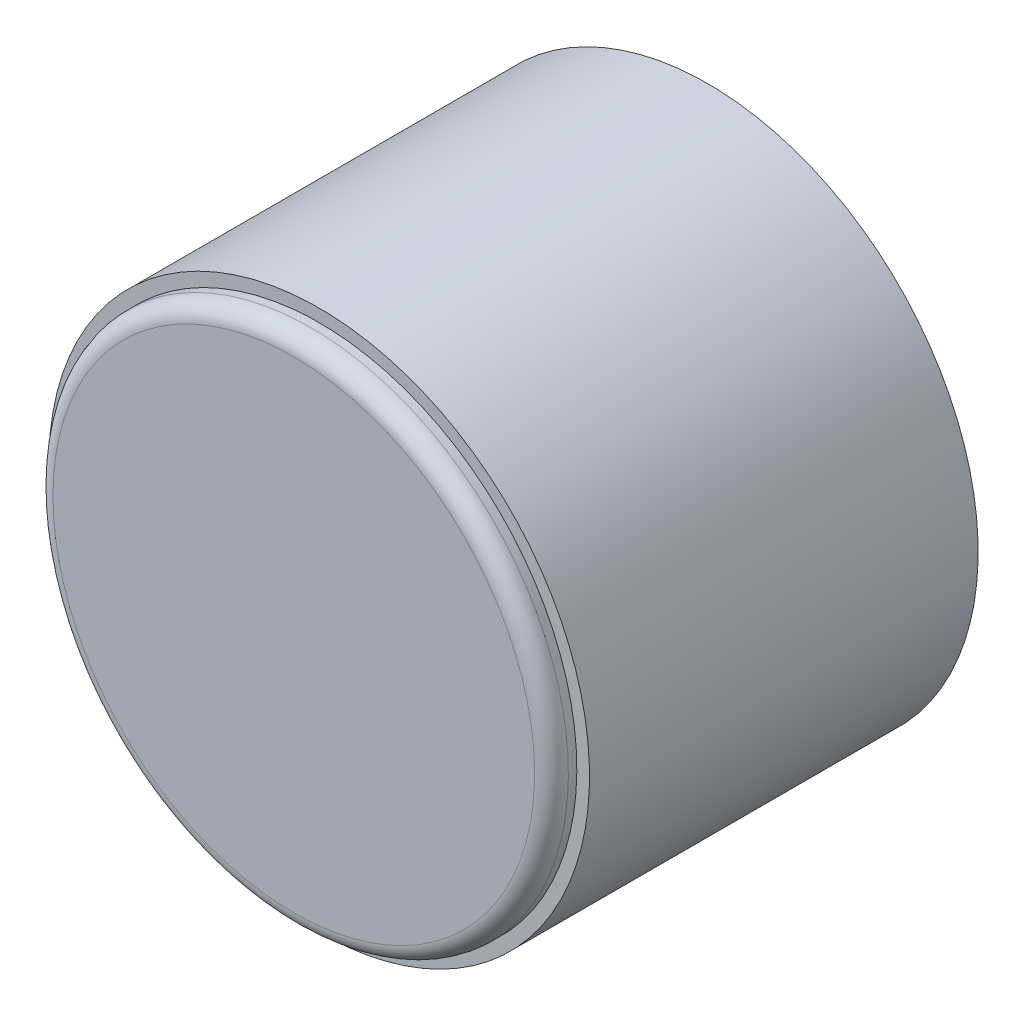
ISO-10303-21;
HEADER;
FILE_DESCRIPTION(('STEP AP214'),'2;1');
FILE_NAME('part.step','',(''),(''),'','','');
FILE_SCHEMA(('AUTOMOTIVE_DESIGN { 1 0 10303 214 1 1 1 1 }'));
ENDSEC;
DATA;
#1=APPLICATION_CONTEXT('core data for automotive mechanical design processes');
#2=APPLICATION_PROTOCOL_DEFINITION('international standard','automotive_design',2000,#1);
#3=PRODUCT_CONTEXT('',#1,'mechanical');
#4=PRODUCT('Part','Part','',(#3));
#5=PRODUCT_RELATED_PRODUCT_CATEGORY('part','',(#4));
#6=PRODUCT_DEFINITION_FORMATION('','',#4);
#7=PRODUCT_DEFINITION_CONTEXT('part definition',#1,'design');
#8=PRODUCT_DEFINITION('design','',#6,#7);
#9=PRODUCT_DEFINITION_SHAPE('','',#8);
#10=(LENGTH_UNIT() NAMED_UNIT(*) SI_UNIT(.MILLI.,.METRE.));
#11=(NAMED_UNIT(*) PLANE_ANGLE_UNIT() SI_UNIT($,.RADIAN.));
#12=(NAMED_UNIT(*) SI_UNIT($,.STERADIAN.) SOLID_ANGLE_UNIT());
#13=UNCERTAINTY_MEASURE_WITH_UNIT(LENGTH_MEASURE(1.E-05),#10,'distance_accuracy_value','');
#14=(GEOMETRIC_REPRESENTATION_CONTEXT(3) GLOBAL_UNCERTAINTY_ASSIGNED_CONTEXT((#13)) GLOBAL_UNIT_ASSIGNED_CONTEXT((#10,
#11,#12)) REPRESENTATION_CONTEXT('',''));
#15=CARTESIAN_POINT('',(0.,0.,0.));
#16=DIRECTION('',(0.,0.,1.));
#17=DIRECTION('',(1.,0.,0.));
#18=AXIS2_PLACEMENT_3D('',#15,#16,#17);
#19=CARTESIAN_POINT('',(-0.0195470693560484,0.0021960919807713,195.292271057495));
#20=DIRECTION('',(0.,0.,1.));
#21=DIRECTION('',(0.,-1.,0.));
#22=AXIS2_PLACEMENT_3D('',#19,#20,#21);
#23=CYLINDRICAL_SURFACE('',#22,16.);
#24=CARTESIAN_POINT('',(-0.0195470693560484,0.0021960919807713,195.292271057495));
#25=DIRECTION('',(0.,0.,1.));
#26=DIRECTION('',(-0.383049008063237,0.923728021347068,0.));
#27=AXIS2_PLACEMENT_3D('',#24,#25,#26);
#28=CIRCLE('',#27,16.);
#29=CARTESIAN_POINT('',(-6.14833119836785,14.7818444335339,195.292271057495));
#30=VERTEX_POINT('',#29);
#31=EDGE_CURVE('E11',#30,#30,#28,.T.);
#32=ORIENTED_EDGE('',*,*,#31,.T.);
#33=EDGE_LOOP('',(#32));
#34=FACE_BOUND('',#33,.T.);
#35=CARTESIAN_POINT('',(-0.0195470693560484,0.0021960919807713,218.292271057495));
#36=DIRECTION('',(0.,0.,1.));
#37=DIRECTION('',(-0.383049008063237,0.923728021347068,0.));
#38=AXIS2_PLACEMENT_3D('',#35,#36,#37);
#39=CIRCLE('',#38,16.);
#40=CARTESIAN_POINT('',(-6.14833119836785,14.7818444335339,218.292271057495));
#41=VERTEX_POINT('',#40);
#42=EDGE_CURVE('E27',#41,#41,#39,.T.);
#43=ORIENTED_EDGE('',*,*,#42,.F.);
#44=EDGE_LOOP('',(#43));
#45=FACE_BOUND('',#44,.T.);
#46=ADVANCED_FACE('F17',(#34,#45),#23,.T.);
#47=CARTESIAN_POINT('',(-0.0195470693560484,0.0021960919807713,195.292271057495));
#48=DIRECTION('',(0.,0.,1.));
#49=DIRECTION('',(0.383049008063238,-0.923728021347068,0.));
#50=AXIS2_PLACEMENT_3D('',#47,#48,#49);
#51=PLANE('',#50);
#52=ORIENTED_EDGE('',*,*,#31,.F.);
#53=EDGE_LOOP('',(#52));
#54=FACE_BOUND('',#53,.T.);
#55=ADVANCED_FACE('F57',(#54),#51,.F.);
#56=CARTESIAN_POINT('',(-0.0195470693560484,0.0021960919807713,218.292271057495));
#57=DIRECTION('',(0.,0.,1.));
#58=DIRECTION('',(0.383049008063238,-0.923728021347068,0.));
#59=AXIS2_PLACEMENT_3D('',#56,#57,#58);
#60=PLANE('',#59);
#61=CARTESIAN_POINT('',(-0.0195470693560484,0.0021960919807713,218.292271057495));
#62=DIRECTION('',(0.,0.,1.));
#63=DIRECTION('',(-0.383049008063237,0.923728021347068,0.));
#64=AXIS2_PLACEMENT_3D('',#61,#62,#63);
#65=CIRCLE('',#64,15.25);
#66=CARTESIAN_POINT('',(-5.86104444232042,14.0890484175236,218.292271057495));
#67=VERTEX_POINT('',#66);
#68=EDGE_CURVE('E47',#67,#67,#65,.T.);
#69=ORIENTED_EDGE('',*,*,#68,.F.);
#70=EDGE_LOOP('',(#69));
#71=FACE_BOUND('',#70,.T.);
#72=ORIENTED_EDGE('',*,*,#42,.T.);
#73=EDGE_LOOP('',(#72));
#74=FACE_BOUND('',#73,.T.);
#75=ADVANCED_FACE('F54',(#71,#74),#60,.T.);
#76=CARTESIAN_POINT('',(-0.0195470693560484,0.0021960919807713,219.792271057495));
#77=DIRECTION('',(0.,0.,-1.));
#78=DIRECTION('',(0.,1.,0.));
#79=AXIS2_PLACEMENT_3D('',#76,#77,#78);
#80=CYLINDRICAL_SURFACE('',#79,15.25);
#81=CARTESIAN_POINT('',(-0.0195470693560484,0.0021960919807713,218.792271057495));
#82=DIRECTION('',(0.,0.,-1.));
#83=DIRECTION('',(0.383049008063238,-0.923728021347068,0.));
#84=AXIS2_PLACEMENT_3D('',#81,#82,#83);
#85=CIRCLE('',#84,15.25);
#86=CARTESIAN_POINT('',(5.82195030360832,-14.084656233562,218.792271057495));
#87=VERTEX_POINT('',#86);
#88=EDGE_CURVE('E42',#87,#87,#85,.T.);
#89=ORIENTED_EDGE('',*,*,#88,.T.);
#90=EDGE_LOOP('',(#89));
#91=FACE_BOUND('',#90,.T.);
#92=ORIENTED_EDGE('',*,*,#68,.T.);
#93=EDGE_LOOP('',(#92));
#94=FACE_BOUND('',#93,.T.);
#95=ADVANCED_FACE('F68',(#91,#94),#80,.T.);
#96=CARTESIAN_POINT('',(-0.0195470693560484,0.0021960919807713,219.792271057495));
#97=DIRECTION('',(0.,0.,1.));
#98=DIRECTION('',(0.383049008063238,-0.923728021347068,0.));
#99=AXIS2_PLACEMENT_3D('',#96,#97,#98);
#100=PLANE('',#99);
#101=CARTESIAN_POINT('',(-0.0195470693560484,0.0021960919807713,219.792271057495));
#102=DIRECTION('',(0.,0.,1.));
#103=DIRECTION('',(0.383049008063238,-0.923728021347068,0.));
#104=AXIS2_PLACEMENT_3D('',#101,#102,#103);
#105=CIRCLE('',#104,14.25);
#106=CARTESIAN_POINT('',(5.43890129554509,-13.1609282122149,219.792271057495));
#107=VERTEX_POINT('',#106);
#108=EDGE_CURVE('E21',#107,#107,#105,.T.);
#109=ORIENTED_EDGE('',*,*,#108,.T.);
#110=EDGE_LOOP('',(#109));
#111=FACE_BOUND('',#110,.T.);
#112=ADVANCED_FACE('F71',(#111),#100,.T.);
#113=CARTESIAN_POINT('',(-0.0195470693560484,0.0021960919807713,218.792271057495));
#114=DIRECTION('',(0.,0.,1.));
#115=DIRECTION('',(0.383049008063238,-0.923728021347068,0.));
#116=AXIS2_PLACEMENT_3D('',#113,#114,#115);
#117=TOROIDAL_SURFACE('',#116,14.25,1.);
#118=ORIENTED_EDGE('',*,*,#88,.F.);
#119=EDGE_LOOP('',(#118));
#120=FACE_BOUND('',#119,.T.);
#121=ORIENTED_EDGE('',*,*,#108,.F.);
#122=EDGE_LOOP('',(#121));
#123=FACE_BOUND('',#122,.T.);
#124=ADVANCED_FACE('F19',(#120,#123),#117,.T.);
#125=CLOSED_SHELL('',(#46,#55,#75,#95,#112,#124));
#126=MANIFOLD_SOLID_BREP('B1',#125);
#127=ADVANCED_BREP_SHAPE_REPRESENTATION('',(#18,#126),#14);
#128=SHAPE_DEFINITION_REPRESENTATION(#9,#127);
ENDSEC;
END-ISO-10303-21;
